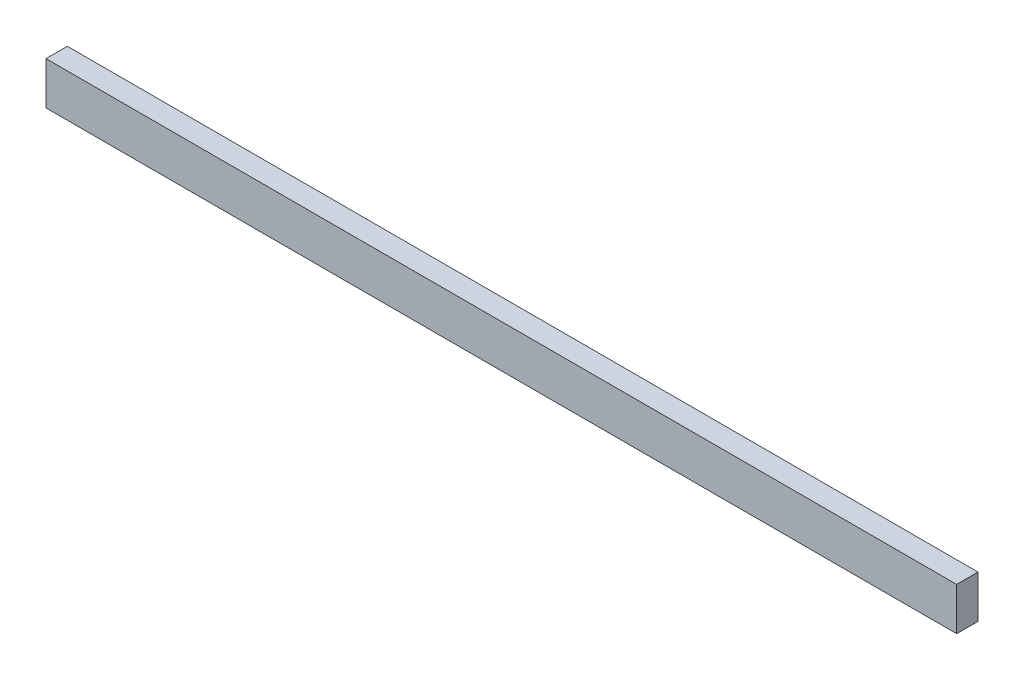
ISO-10303-21;
HEADER;
FILE_DESCRIPTION(('STEP AP214'),'2;1');
FILE_NAME('part.step','',(''),(''),'','','');
FILE_SCHEMA(('AUTOMOTIVE_DESIGN { 1 0 10303 214 1 1 1 1 }'));
ENDSEC;
DATA;
#1=APPLICATION_CONTEXT('core data for automotive mechanical design processes');
#2=APPLICATION_PROTOCOL_DEFINITION('international standard','automotive_design',2000,#1);
#3=PRODUCT_CONTEXT('',#1,'mechanical');
#4=PRODUCT('Part','Part','',(#3));
#5=PRODUCT_RELATED_PRODUCT_CATEGORY('part','',(#4));
#6=PRODUCT_DEFINITION_FORMATION('','',#4);
#7=PRODUCT_DEFINITION_CONTEXT('part definition',#1,'design');
#8=PRODUCT_DEFINITION('design','',#6,#7);
#9=PRODUCT_DEFINITION_SHAPE('','',#8);
#10=(LENGTH_UNIT() NAMED_UNIT(*) SI_UNIT(.MILLI.,.METRE.));
#11=(NAMED_UNIT(*) PLANE_ANGLE_UNIT() SI_UNIT($,.RADIAN.));
#12=(NAMED_UNIT(*) SI_UNIT($,.STERADIAN.) SOLID_ANGLE_UNIT());
#13=UNCERTAINTY_MEASURE_WITH_UNIT(LENGTH_MEASURE(1.E-05),#10,'distance_accuracy_value','');
#14=(GEOMETRIC_REPRESENTATION_CONTEXT(3) GLOBAL_UNCERTAINTY_ASSIGNED_CONTEXT((#13)) GLOBAL_UNIT_ASSIGNED_CONTEXT((#10,
#11,#12)) REPRESENTATION_CONTEXT('',''));
#15=CARTESIAN_POINT('',(0.,0.,0.));
#16=DIRECTION('',(0.,0.,1.));
#17=DIRECTION('',(1.,0.,0.));
#18=AXIS2_PLACEMENT_3D('',#15,#16,#17);
#19=CARTESIAN_POINT('',(549.821321331555,30.3496799940561,25.4));
#20=DIRECTION('',(0.,-1.,0.));
#21=DIRECTION('',(1.,0.,0.));
#22=AXIS2_PLACEMENT_3D('',#19,#20,#21);
#23=PLANE('',#22);
#24=DIRECTION('',(-1.,0.,0.));
#25=VECTOR('',#24,1.);
#26=CARTESIAN_POINT('',(549.821321331555,30.3496799940561,0.));
#27=LINE('',#26,#25);
#28=CARTESIAN_POINT('',(549.821321331555,30.3496799940561,0.));
#29=VERTEX_POINT('',#28);
#30=CARTESIAN_POINT('',(-533.322388018034,30.3496799940564,0.));
#31=VERTEX_POINT('',#30);
#32=EDGE_CURVE('E100',#29,#31,#27,.T.);
#33=ORIENTED_EDGE('',*,*,#32,.T.);
#34=DIRECTION('',(0.,0.,-1.));
#35=VECTOR('',#34,1.);
#36=CARTESIAN_POINT('',(-533.322388018034,30.3496799940564,25.4));
#37=LINE('',#36,#35);
#38=CARTESIAN_POINT('',(-533.322388018034,30.3496799940564,25.4));
#39=VERTEX_POINT('',#38);
#40=EDGE_CURVE('E11',#39,#31,#37,.T.);
#41=ORIENTED_EDGE('',*,*,#40,.F.);
#42=DIRECTION('',(-1.,0.,0.));
#43=VECTOR('',#42,1.);
#44=CARTESIAN_POINT('',(549.821321331555,30.3496799940561,25.4));
#45=LINE('',#44,#43);
#46=CARTESIAN_POINT('',(549.821321331555,30.3496799940561,25.4));
#47=VERTEX_POINT('',#46);
#48=EDGE_CURVE('E88',#47,#39,#45,.T.);
#49=ORIENTED_EDGE('',*,*,#48,.F.);
#50=DIRECTION('',(0.,0.,-1.));
#51=VECTOR('',#50,1.);
#52=CARTESIAN_POINT('',(549.821321331555,30.3496799940561,25.4));
#53=LINE('',#52,#51);
#54=EDGE_CURVE('E96',#47,#29,#53,.T.);
#55=ORIENTED_EDGE('',*,*,#54,.T.);
#56=EDGE_LOOP('',(#33,#41,#49,#55));
#57=FACE_BOUND('',#56,.T.);
#58=ADVANCED_FACE('F37',(#57),#23,.F.);
#59=CARTESIAN_POINT('',(-533.322388018034,30.3496799940564,25.4));
#60=DIRECTION('',(1.,0.,0.));
#61=DIRECTION('',(0.,0.,-1.));
#62=AXIS2_PLACEMENT_3D('',#59,#60,#61);
#63=PLANE('',#62);
#64=DIRECTION('',(0.,-1.,0.));
#65=VECTOR('',#64,1.);
#66=CARTESIAN_POINT('',(-533.322388018034,30.3496799940564,0.));
#67=LINE('',#66,#65);
#68=CARTESIAN_POINT('',(-533.322388018034,-20.4503200059437,0.));
#69=VERTEX_POINT('',#68);
#70=EDGE_CURVE('E92',#31,#69,#67,.T.);
#71=ORIENTED_EDGE('',*,*,#70,.T.);
#72=DIRECTION('',(0.,0.,-1.));
#73=VECTOR('',#72,1.);
#74=CARTESIAN_POINT('',(-533.322388018034,-20.4503200059437,25.4));
#75=LINE('',#74,#73);
#76=CARTESIAN_POINT('',(-533.322388018034,-20.4503200059437,25.4));
#77=VERTEX_POINT('',#76);
#78=EDGE_CURVE('E45',#77,#69,#75,.T.);
#79=ORIENTED_EDGE('',*,*,#78,.F.);
#80=DIRECTION('',(0.,-1.,0.));
#81=VECTOR('',#80,1.);
#82=CARTESIAN_POINT('',(-533.322388018034,30.3496799940564,25.4));
#83=LINE('',#82,#81);
#84=EDGE_CURVE('E83',#39,#77,#83,.T.);
#85=ORIENTED_EDGE('',*,*,#84,.F.);
#86=ORIENTED_EDGE('',*,*,#40,.T.);
#87=EDGE_LOOP('',(#71,#79,#85,#86));
#88=FACE_BOUND('',#87,.T.);
#89=ADVANCED_FACE('F91',(#88),#63,.F.);
#90=CARTESIAN_POINT('',(549.821321331555,-20.4503200059438,25.4));
#91=DIRECTION('',(0.,1.,0.));
#92=DIRECTION('',(-1.,0.,0.));
#93=AXIS2_PLACEMENT_3D('',#90,#91,#92);
#94=PLANE('',#93);
#95=DIRECTION('',(1.,0.,0.));
#96=VECTOR('',#95,1.);
#97=CARTESIAN_POINT('',(549.821321331555,-20.4503200059438,0.));
#98=LINE('',#97,#96);
#99=CARTESIAN_POINT('',(549.821321331555,-20.4503200059438,0.));
#100=VERTEX_POINT('',#99);
#101=EDGE_CURVE('E70',#69,#100,#98,.T.);
#102=ORIENTED_EDGE('',*,*,#101,.T.);
#103=DIRECTION('',(0.,0.,-1.));
#104=VECTOR('',#103,1.);
#105=CARTESIAN_POINT('',(549.821321331555,-20.4503200059438,25.4));
#106=LINE('',#105,#104);
#107=CARTESIAN_POINT('',(549.821321331555,-20.4503200059438,25.4));
#108=VERTEX_POINT('',#107);
#109=EDGE_CURVE('E93',#108,#100,#106,.T.);
#110=ORIENTED_EDGE('',*,*,#109,.F.);
#111=DIRECTION('',(1.,0.,0.));
#112=VECTOR('',#111,1.);
#113=CARTESIAN_POINT('',(549.821321331555,-20.4503200059438,25.4));
#114=LINE('',#113,#112);
#115=EDGE_CURVE('E86',#77,#108,#114,.T.);
#116=ORIENTED_EDGE('',*,*,#115,.F.);
#117=ORIENTED_EDGE('',*,*,#78,.T.);
#118=EDGE_LOOP('',(#102,#110,#116,#117));
#119=FACE_BOUND('',#118,.T.);
#120=ADVANCED_FACE('F94',(#119),#94,.F.);
#121=CARTESIAN_POINT('',(549.821321331555,30.3496799940561,25.4));
#122=DIRECTION('',(-1.,0.,0.));
#123=DIRECTION('',(0.,0.,1.));
#124=AXIS2_PLACEMENT_3D('',#121,#122,#123);
#125=PLANE('',#124);
#126=DIRECTION('',(0.,1.,0.));
#127=VECTOR('',#126,1.);
#128=CARTESIAN_POINT('',(549.821321331555,30.3496799940561,0.));
#129=LINE('',#128,#127);
#130=EDGE_CURVE('E76',#100,#29,#129,.T.);
#131=ORIENTED_EDGE('',*,*,#130,.T.);
#132=ORIENTED_EDGE('',*,*,#54,.F.);
#133=DIRECTION('',(0.,1.,0.));
#134=VECTOR('',#133,1.);
#135=CARTESIAN_POINT('',(549.821321331555,30.3496799940561,25.4));
#136=LINE('',#135,#134);
#137=EDGE_CURVE('E53',#108,#47,#136,.T.);
#138=ORIENTED_EDGE('',*,*,#137,.F.);
#139=ORIENTED_EDGE('',*,*,#109,.T.);
#140=EDGE_LOOP('',(#131,#132,#138,#139));
#141=FACE_BOUND('',#140,.T.);
#142=ADVANCED_FACE('F107',(#141),#125,.F.);
#143=CARTESIAN_POINT('',(0.,0.,25.4));
#144=DIRECTION('',(0.,0.,1.));
#145=DIRECTION('',(1.,0.,0.));
#146=AXIS2_PLACEMENT_3D('',#143,#144,#145);
#147=PLANE('',#146);
#148=ORIENTED_EDGE('',*,*,#48,.T.);
#149=ORIENTED_EDGE('',*,*,#84,.T.);
#150=ORIENTED_EDGE('',*,*,#115,.T.);
#151=ORIENTED_EDGE('',*,*,#137,.T.);
#152=EDGE_LOOP('',(#148,#149,#150,#151));
#153=FACE_BOUND('',#152,.T.);
#154=ADVANCED_FACE('F84',(#153),#147,.T.);
#155=CARTESIAN_POINT('',(0.,0.,0.));
#156=DIRECTION('',(0.,0.,1.));
#157=DIRECTION('',(1.,0.,0.));
#158=AXIS2_PLACEMENT_3D('',#155,#156,#157);
#159=PLANE('',#158);
#160=ORIENTED_EDGE('',*,*,#32,.F.);
#161=ORIENTED_EDGE('',*,*,#130,.F.);
#162=ORIENTED_EDGE('',*,*,#101,.F.);
#163=ORIENTED_EDGE('',*,*,#70,.F.);
#164=EDGE_LOOP('',(#160,#161,#162,#163));
#165=FACE_BOUND('',#164,.T.);
#166=ADVANCED_FACE('F110',(#165),#159,.F.);
#167=CLOSED_SHELL('',(#58,#89,#120,#142,#154,#166));
#168=MANIFOLD_SOLID_BREP('B2',#167);
#169=ADVANCED_BREP_SHAPE_REPRESENTATION('',(#18,#168),#14);
#170=SHAPE_DEFINITION_REPRESENTATION(#9,#169);
ENDSEC;
END-ISO-10303-21;
